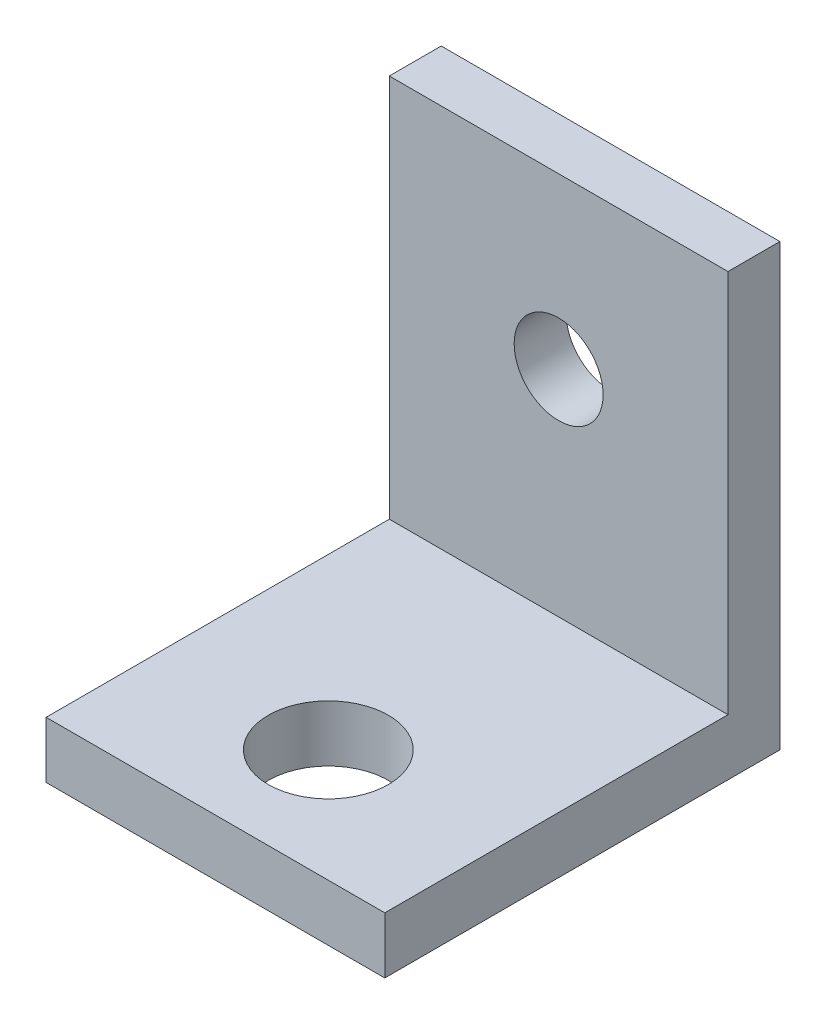
ISO-10303-21;
HEADER;
FILE_DESCRIPTION(('STEP AP214'),'2;1');
FILE_NAME('part.step','',(''),(''),'','','');
FILE_SCHEMA(('AUTOMOTIVE_DESIGN { 1 0 10303 214 1 1 1 1 }'));
ENDSEC;
DATA;
#1=APPLICATION_CONTEXT('core data for automotive mechanical design processes');
#2=APPLICATION_PROTOCOL_DEFINITION('international standard','automotive_design',2000,#1);
#3=PRODUCT_CONTEXT('',#1,'mechanical');
#4=PRODUCT('Part','Part','',(#3));
#5=PRODUCT_RELATED_PRODUCT_CATEGORY('part','',(#4));
#6=PRODUCT_DEFINITION_FORMATION('','',#4);
#7=PRODUCT_DEFINITION_CONTEXT('part definition',#1,'design');
#8=PRODUCT_DEFINITION('design','',#6,#7);
#9=PRODUCT_DEFINITION_SHAPE('','',#8);
#10=(LENGTH_UNIT() NAMED_UNIT(*) SI_UNIT(.MILLI.,.METRE.));
#11=(NAMED_UNIT(*) PLANE_ANGLE_UNIT() SI_UNIT($,.RADIAN.));
#12=(NAMED_UNIT(*) SI_UNIT($,.STERADIAN.) SOLID_ANGLE_UNIT());
#13=UNCERTAINTY_MEASURE_WITH_UNIT(LENGTH_MEASURE(1.E-05),#10,'distance_accuracy_value','');
#14=(GEOMETRIC_REPRESENTATION_CONTEXT(3) GLOBAL_UNCERTAINTY_ASSIGNED_CONTEXT((#13)) GLOBAL_UNIT_ASSIGNED_CONTEXT((#10,
#11,#12)) REPRESENTATION_CONTEXT('',''));
#15=CARTESIAN_POINT('',(0.,0.,0.));
#16=DIRECTION('',(0.,0.,1.));
#17=DIRECTION('',(1.,0.,0.));
#18=AXIS2_PLACEMENT_3D('',#15,#16,#17);
#19=CARTESIAN_POINT('',(0.,3.175,0.));
#20=DIRECTION('',(0.,-1.,0.));
#21=DIRECTION('',(0.,0.,-1.));
#22=AXIS2_PLACEMENT_3D('',#19,#20,#21);
#23=PLANE('',#22);
#24=CARTESIAN_POINT('',(9.525,3.175,-6.35));
#25=DIRECTION('',(0.,1.,0.));
#26=DIRECTION('',(0.,0.,1.));
#27=AXIS2_PLACEMENT_3D('',#24,#25,#26);
#28=CIRCLE('',#27,3.37819999999999);
#29=CARTESIAN_POINT('',(9.525,3.175,-2.97180000000001));
#30=VERTEX_POINT('',#29);
#31=EDGE_CURVE('E184',#30,#30,#28,.T.);
#32=ORIENTED_EDGE('',*,*,#31,.F.);
#33=EDGE_LOOP('',(#32));
#34=FACE_BOUND('',#33,.T.);
#35=DIRECTION('',(1.,0.,0.));
#36=VECTOR('',#35,1.);
#37=CARTESIAN_POINT('',(0.,3.175,-19.304));
#38=LINE('',#37,#36);
#39=CARTESIAN_POINT('',(0.,3.175,-19.304));
#40=VERTEX_POINT('',#39);
#41=CARTESIAN_POINT('',(19.05,3.175,-19.304));
#42=VERTEX_POINT('',#41);
#43=EDGE_CURVE('E56',#40,#42,#38,.T.);
#44=ORIENTED_EDGE('',*,*,#43,.F.);
#45=DIRECTION('',(0.,0.,1.));
#46=VECTOR('',#45,1.);
#47=CARTESIAN_POINT('',(0.,3.175,0.));
#48=LINE('',#47,#46);
#49=CARTESIAN_POINT('',(0.,3.175,0.));
#50=VERTEX_POINT('',#49);
#51=EDGE_CURVE('E107',#40,#50,#48,.T.);
#52=ORIENTED_EDGE('',*,*,#51,.T.);
#53=DIRECTION('',(1.,0.,0.));
#54=VECTOR('',#53,1.);
#55=CARTESIAN_POINT('',(0.,3.175,0.));
#56=LINE('',#55,#54);
#57=CARTESIAN_POINT('',(19.05,3.175,0.));
#58=VERTEX_POINT('',#57);
#59=EDGE_CURVE('E146',#50,#58,#56,.T.);
#60=ORIENTED_EDGE('',*,*,#59,.T.);
#61=DIRECTION('',(0.,0.,-1.));
#62=VECTOR('',#61,1.);
#63=CARTESIAN_POINT('',(19.05,3.175,0.));
#64=LINE('',#63,#62);
#65=EDGE_CURVE('E117',#58,#42,#64,.T.);
#66=ORIENTED_EDGE('',*,*,#65,.T.);
#67=EDGE_LOOP('',(#44,#52,#60,#66));
#68=FACE_BOUND('',#67,.T.);
#69=ADVANCED_FACE('F37',(#34,#68),#23,.F.);
#70=CARTESIAN_POINT('',(0.,3.175,0.));
#71=DIRECTION('',(1.,0.,0.));
#72=DIRECTION('',(0.,0.,-1.));
#73=AXIS2_PLACEMENT_3D('',#70,#71,#72);
#74=PLANE('',#73);
#75=DIRECTION('',(0.,0.,1.));
#76=VECTOR('',#75,1.);
#77=CARTESIAN_POINT('',(0.,0.,0.));
#78=LINE('',#77,#76);
#79=CARTESIAN_POINT('',(0.,0.,-22.225));
#80=VERTEX_POINT('',#79);
#81=CARTESIAN_POINT('',(0.,0.,0.));
#82=VERTEX_POINT('',#81);
#83=EDGE_CURVE('E114',#80,#82,#78,.T.);
#84=ORIENTED_EDGE('',*,*,#83,.T.);
#85=DIRECTION('',(0.,-1.,0.));
#86=VECTOR('',#85,1.);
#87=CARTESIAN_POINT('',(0.,3.175,0.));
#88=LINE('',#87,#86);
#89=EDGE_CURVE('E12',#50,#82,#88,.T.);
#90=ORIENTED_EDGE('',*,*,#89,.F.);
#91=ORIENTED_EDGE('',*,*,#51,.F.);
#92=DIRECTION('',(0.,-1.,0.));
#93=VECTOR('',#92,1.);
#94=CARTESIAN_POINT('',(0.,24.765,-19.304));
#95=LINE('',#94,#93);
#96=CARTESIAN_POINT('',(0.,24.765,-19.304));
#97=VERTEX_POINT('',#96);
#98=EDGE_CURVE('E121',#97,#40,#95,.T.);
#99=ORIENTED_EDGE('',*,*,#98,.F.);
#100=DIRECTION('',(0.,0.,1.));
#101=VECTOR('',#100,1.);
#102=CARTESIAN_POINT('',(0.,24.765,-22.225));
#103=LINE('',#102,#101);
#104=CARTESIAN_POINT('',(0.,24.765,-22.225));
#105=VERTEX_POINT('',#104);
#106=EDGE_CURVE('E116',#105,#97,#103,.T.);
#107=ORIENTED_EDGE('',*,*,#106,.F.);
#108=DIRECTION('',(0.,-1.,0.));
#109=VECTOR('',#108,1.);
#110=CARTESIAN_POINT('',(0.,3.175,-22.225));
#111=LINE('',#110,#109);
#112=EDGE_CURVE('E103',#105,#80,#111,.T.);
#113=ORIENTED_EDGE('',*,*,#112,.T.);
#114=EDGE_LOOP('',(#84,#90,#91,#99,#107,#113));
#115=FACE_BOUND('',#114,.T.);
#116=ADVANCED_FACE('F112',(#115),#74,.F.);
#117=CARTESIAN_POINT('',(0.,3.175,0.));
#118=DIRECTION('',(0.,0.,-1.));
#119=DIRECTION('',(-1.,0.,0.));
#120=AXIS2_PLACEMENT_3D('',#117,#118,#119);
#121=PLANE('',#120);
#122=DIRECTION('',(1.,0.,0.));
#123=VECTOR('',#122,1.);
#124=CARTESIAN_POINT('',(0.,0.,0.));
#125=LINE('',#124,#123);
#126=CARTESIAN_POINT('',(19.05,0.,0.));
#127=VERTEX_POINT('',#126);
#128=EDGE_CURVE('E120',#82,#127,#125,.T.);
#129=ORIENTED_EDGE('',*,*,#128,.T.);
#130=DIRECTION('',(0.,-1.,0.));
#131=VECTOR('',#130,1.);
#132=CARTESIAN_POINT('',(19.05,3.175,0.));
#133=LINE('',#132,#131);
#134=EDGE_CURVE('E47',#58,#127,#133,.T.);
#135=ORIENTED_EDGE('',*,*,#134,.F.);
#136=ORIENTED_EDGE('',*,*,#59,.F.);
#137=ORIENTED_EDGE('',*,*,#89,.T.);
#138=EDGE_LOOP('',(#129,#135,#136,#137));
#139=FACE_BOUND('',#138,.T.);
#140=ADVANCED_FACE('F152',(#139),#121,.F.);
#141=CARTESIAN_POINT('',(19.05,3.175,0.));
#142=DIRECTION('',(-1.,0.,0.));
#143=DIRECTION('',(0.,0.,1.));
#144=AXIS2_PLACEMENT_3D('',#141,#142,#143);
#145=PLANE('',#144);
#146=DIRECTION('',(0.,0.,-1.));
#147=VECTOR('',#146,1.);
#148=CARTESIAN_POINT('',(19.05,0.,0.));
#149=LINE('',#148,#147);
#150=CARTESIAN_POINT('',(19.05,0.,-22.225));
#151=VERTEX_POINT('',#150);
#152=EDGE_CURVE('E95',#127,#151,#149,.T.);
#153=ORIENTED_EDGE('',*,*,#152,.T.);
#154=DIRECTION('',(0.,-1.,0.));
#155=VECTOR('',#154,1.);
#156=CARTESIAN_POINT('',(19.05,3.175,-22.225));
#157=LINE('',#156,#155);
#158=CARTESIAN_POINT('',(19.05,24.765,-22.225));
#159=VERTEX_POINT('',#158);
#160=EDGE_CURVE('E82',#159,#151,#157,.T.);
#161=ORIENTED_EDGE('',*,*,#160,.F.);
#162=DIRECTION('',(0.,0.,-1.));
#163=VECTOR('',#162,1.);
#164=CARTESIAN_POINT('',(19.05,24.765,-22.225));
#165=LINE('',#164,#163);
#166=CARTESIAN_POINT('',(19.05,24.765,-19.304));
#167=VERTEX_POINT('',#166);
#168=EDGE_CURVE('E138',#167,#159,#165,.T.);
#169=ORIENTED_EDGE('',*,*,#168,.F.);
#170=DIRECTION('',(0.,-1.,0.));
#171=VECTOR('',#170,1.);
#172=CARTESIAN_POINT('',(19.05,3.175,-19.304));
#173=LINE('',#172,#171);
#174=EDGE_CURVE('E125',#167,#42,#173,.T.);
#175=ORIENTED_EDGE('',*,*,#174,.T.);
#176=ORIENTED_EDGE('',*,*,#65,.F.);
#177=ORIENTED_EDGE('',*,*,#134,.T.);
#178=EDGE_LOOP('',(#153,#161,#169,#175,#176,#177));
#179=FACE_BOUND('',#178,.T.);
#180=ADVANCED_FACE('F153',(#179),#145,.F.);
#181=CARTESIAN_POINT('',(0.,3.175,-22.225));
#182=DIRECTION('',(0.,0.,1.));
#183=DIRECTION('',(1.,0.,0.));
#184=AXIS2_PLACEMENT_3D('',#181,#182,#183);
#185=PLANE('',#184);
#186=CARTESIAN_POINT('',(9.525,15.24,-22.225));
#187=DIRECTION('',(0.,0.,1.));
#188=DIRECTION('',(1.,0.,0.));
#189=AXIS2_PLACEMENT_3D('',#186,#187,#188);
#190=CIRCLE('',#189,2.5019);
#191=CARTESIAN_POINT('',(12.0269,15.24,-22.225));
#192=VERTEX_POINT('',#191);
#193=EDGE_CURVE('E41',#192,#192,#190,.T.);
#194=ORIENTED_EDGE('',*,*,#193,.T.);
#195=EDGE_LOOP('',(#194));
#196=FACE_BOUND('',#195,.T.);
#197=DIRECTION('',(-1.,0.,0.));
#198=VECTOR('',#197,1.);
#199=CARTESIAN_POINT('',(0.,0.,-22.225));
#200=LINE('',#199,#198);
#201=EDGE_CURVE('E99',#151,#80,#200,.T.);
#202=ORIENTED_EDGE('',*,*,#201,.T.);
#203=ORIENTED_EDGE('',*,*,#112,.F.);
#204=DIRECTION('',(-1.,0.,0.));
#205=VECTOR('',#204,1.);
#206=CARTESIAN_POINT('',(0.,24.765,-22.225));
#207=LINE('',#206,#205);
#208=EDGE_CURVE('E140',#159,#105,#207,.T.);
#209=ORIENTED_EDGE('',*,*,#208,.F.);
#210=ORIENTED_EDGE('',*,*,#160,.T.);
#211=EDGE_LOOP('',(#202,#203,#209,#210));
#212=FACE_BOUND('',#211,.T.);
#213=ADVANCED_FACE('F101',(#196,#212),#185,.F.);
#214=CARTESIAN_POINT('',(0.,0.,0.));
#215=DIRECTION('',(0.,-1.,0.));
#216=DIRECTION('',(0.,0.,-1.));
#217=AXIS2_PLACEMENT_3D('',#214,#215,#216);
#218=PLANE('',#217);
#219=CARTESIAN_POINT('',(9.525,0.,-6.35));
#220=DIRECTION('',(0.,1.,0.));
#221=DIRECTION('',(0.,0.,1.));
#222=AXIS2_PLACEMENT_3D('',#219,#220,#221);
#223=CIRCLE('',#222,3.3782);
#224=CARTESIAN_POINT('',(9.525,0.,-2.9718));
#225=VERTEX_POINT('',#224);
#226=EDGE_CURVE('E136',#225,#225,#223,.T.);
#227=ORIENTED_EDGE('',*,*,#226,.T.);
#228=EDGE_LOOP('',(#227));
#229=FACE_BOUND('',#228,.T.);
#230=ORIENTED_EDGE('',*,*,#83,.F.);
#231=ORIENTED_EDGE('',*,*,#201,.F.);
#232=ORIENTED_EDGE('',*,*,#152,.F.);
#233=ORIENTED_EDGE('',*,*,#128,.F.);
#234=EDGE_LOOP('',(#230,#231,#232,#233));
#235=FACE_BOUND('',#234,.T.);
#236=ADVANCED_FACE('F119',(#229,#235),#218,.T.);
#237=CARTESIAN_POINT('',(0.,24.765,-19.304));
#238=DIRECTION('',(0.,0.,-1.));
#239=DIRECTION('',(-1.,0.,0.));
#240=AXIS2_PLACEMENT_3D('',#237,#238,#239);
#241=PLANE('',#240);
#242=CARTESIAN_POINT('',(9.525,15.24,-19.304));
#243=DIRECTION('',(0.,0.,-1.));
#244=DIRECTION('',(-1.,0.,0.));
#245=AXIS2_PLACEMENT_3D('',#242,#243,#244);
#246=CIRCLE('',#245,2.5019);
#247=CARTESIAN_POINT('',(7.0231,15.24,-19.304));
#248=VERTEX_POINT('',#247);
#249=EDGE_CURVE('E133',#248,#248,#246,.F.);
#250=ORIENTED_EDGE('',*,*,#249,.F.);
#251=EDGE_LOOP('',(#250));
#252=FACE_BOUND('',#251,.T.);
#253=ORIENTED_EDGE('',*,*,#43,.T.);
#254=ORIENTED_EDGE('',*,*,#174,.F.);
#255=DIRECTION('',(1.,0.,0.));
#256=VECTOR('',#255,1.);
#257=CARTESIAN_POINT('',(0.,24.765,-19.304));
#258=LINE('',#257,#256);
#259=EDGE_CURVE('E73',#97,#167,#258,.T.);
#260=ORIENTED_EDGE('',*,*,#259,.F.);
#261=ORIENTED_EDGE('',*,*,#98,.T.);
#262=EDGE_LOOP('',(#253,#254,#260,#261));
#263=FACE_BOUND('',#262,.T.);
#264=ADVANCED_FACE('F150',(#252,#263),#241,.F.);
#265=CARTESIAN_POINT('',(0.,24.765,0.));
#266=DIRECTION('',(0.,1.,0.));
#267=DIRECTION('',(0.,0.,1.));
#268=AXIS2_PLACEMENT_3D('',#265,#266,#267);
#269=PLANE('',#268);
#270=ORIENTED_EDGE('',*,*,#106,.T.);
#271=ORIENTED_EDGE('',*,*,#259,.T.);
#272=ORIENTED_EDGE('',*,*,#168,.T.);
#273=ORIENTED_EDGE('',*,*,#208,.T.);
#274=EDGE_LOOP('',(#270,#271,#272,#273));
#275=FACE_BOUND('',#274,.T.);
#276=ADVANCED_FACE('F173',(#275),#269,.T.);
#277=CARTESIAN_POINT('',(9.525,3.175,-6.35));
#278=DIRECTION('',(0.,1.,0.));
#279=DIRECTION('',(0.,0.,1.));
#280=AXIS2_PLACEMENT_3D('',#277,#278,#279);
#281=CYLINDRICAL_SURFACE('',#280,3.37819999999999);
#282=ORIENTED_EDGE('',*,*,#226,.F.);
#283=EDGE_LOOP('',(#282));
#284=FACE_BOUND('',#283,.T.);
#285=ORIENTED_EDGE('',*,*,#31,.T.);
#286=EDGE_LOOP('',(#285));
#287=FACE_BOUND('',#286,.T.);
#288=ADVANCED_FACE('F189',(#284,#287),#281,.F.);
#289=CARTESIAN_POINT('',(9.525,15.24,-19.05));
#290=DIRECTION('',(0.,0.,1.));
#291=DIRECTION('',(1.,0.,0.));
#292=AXIS2_PLACEMENT_3D('',#289,#290,#291);
#293=CYLINDRICAL_SURFACE('',#292,2.5019);
#294=ORIENTED_EDGE('',*,*,#193,.F.);
#295=EDGE_LOOP('',(#294));
#296=FACE_BOUND('',#295,.T.);
#297=ORIENTED_EDGE('',*,*,#249,.T.);
#298=EDGE_LOOP('',(#297));
#299=FACE_BOUND('',#298,.T.);
#300=ADVANCED_FACE('F39',(#296,#299),#293,.F.);
#301=CLOSED_SHELL('',(#69,#116,#140,#180,#213,#236,#264,#276,#288,#300));
#302=MANIFOLD_SOLID_BREP('B2',#301);
#303=ADVANCED_BREP_SHAPE_REPRESENTATION('',(#18,#302),#14);
#304=SHAPE_DEFINITION_REPRESENTATION(#9,#303);
ENDSEC;
END-ISO-10303-21;
